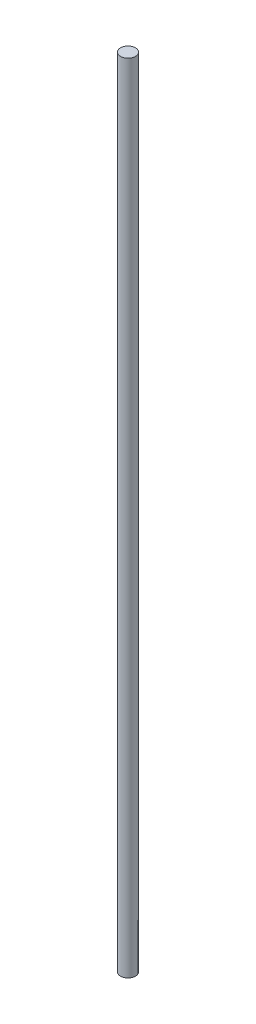
ISO-10303-21;
HEADER;
FILE_DESCRIPTION(('STEP AP214'),'2;1');
FILE_NAME('part.step','',(''),(''),'','','');
FILE_SCHEMA(('AUTOMOTIVE_DESIGN { 1 0 10303 214 1 1 1 1 }'));
ENDSEC;
DATA;
#1=APPLICATION_CONTEXT('core data for automotive mechanical design processes');
#2=APPLICATION_PROTOCOL_DEFINITION('international standard','automotive_design',2000,#1);
#3=PRODUCT_CONTEXT('',#1,'mechanical');
#4=PRODUCT('Part','Part','',(#3));
#5=PRODUCT_RELATED_PRODUCT_CATEGORY('part','',(#4));
#6=PRODUCT_DEFINITION_FORMATION('','',#4);
#7=PRODUCT_DEFINITION_CONTEXT('part definition',#1,'design');
#8=PRODUCT_DEFINITION('design','',#6,#7);
#9=PRODUCT_DEFINITION_SHAPE('','',#8);
#10=(LENGTH_UNIT() NAMED_UNIT(*) SI_UNIT(.MILLI.,.METRE.));
#11=(NAMED_UNIT(*) PLANE_ANGLE_UNIT() SI_UNIT($,.RADIAN.));
#12=(NAMED_UNIT(*) SI_UNIT($,.STERADIAN.) SOLID_ANGLE_UNIT());
#13=UNCERTAINTY_MEASURE_WITH_UNIT(LENGTH_MEASURE(1.E-05),#10,'distance_accuracy_value','');
#14=(GEOMETRIC_REPRESENTATION_CONTEXT(3) GLOBAL_UNCERTAINTY_ASSIGNED_CONTEXT((#13)) GLOBAL_UNIT_ASSIGNED_CONTEXT((#10,
#11,#12)) REPRESENTATION_CONTEXT('',''));
#15=CARTESIAN_POINT('',(0.,0.,0.));
#16=DIRECTION('',(0.,0.,1.));
#17=DIRECTION('',(1.,0.,0.));
#18=AXIS2_PLACEMENT_3D('',#15,#16,#17);
#19=CARTESIAN_POINT('',(0.,480.,0.));
#20=DIRECTION('',(0.,-1.,0.));
#21=DIRECTION('',(0.,0.,-1.));
#22=AXIS2_PLACEMENT_3D('',#19,#20,#21);
#23=CYLINDRICAL_SURFACE('',#22,4.5);
#24=CARTESIAN_POINT('',(0.,480.,0.));
#25=DIRECTION('',(0.,1.,0.));
#26=DIRECTION('',(0.,0.,1.));
#27=AXIS2_PLACEMENT_3D('',#24,#25,#26);
#28=CIRCLE('',#27,4.5);
#29=CARTESIAN_POINT('',(0.,480.,4.5));
#30=VERTEX_POINT('',#29);
#31=EDGE_CURVE('E10',#30,#30,#28,.T.);
#32=ORIENTED_EDGE('',*,*,#31,.F.);
#33=EDGE_LOOP('',(#32));
#34=FACE_BOUND('',#33,.T.);
#35=CARTESIAN_POINT('',(0.,0.,0.));
#36=DIRECTION('',(0.,1.,0.));
#37=DIRECTION('',(0.,0.,1.));
#38=AXIS2_PLACEMENT_3D('',#35,#36,#37);
#39=CIRCLE('',#38,4.5);
#40=CARTESIAN_POINT('',(0.,0.,4.5));
#41=VERTEX_POINT('',#40);
#42=EDGE_CURVE('E34',#41,#41,#39,.T.);
#43=ORIENTED_EDGE('',*,*,#42,.T.);
#44=EDGE_LOOP('',(#43));
#45=FACE_BOUND('',#44,.T.);
#46=ADVANCED_FACE('F31',(#34,#45),#23,.T.);
#47=CARTESIAN_POINT('',(0.,480.,0.));
#48=DIRECTION('',(0.,1.,0.));
#49=DIRECTION('',(0.,0.,1.));
#50=AXIS2_PLACEMENT_3D('',#47,#48,#49);
#51=PLANE('',#50);
#52=ORIENTED_EDGE('',*,*,#31,.T.);
#53=EDGE_LOOP('',(#52));
#54=FACE_BOUND('',#53,.T.);
#55=ADVANCED_FACE('F46',(#54),#51,.T.);
#56=CARTESIAN_POINT('',(0.,0.,0.));
#57=DIRECTION('',(0.,1.,0.));
#58=DIRECTION('',(0.,0.,1.));
#59=AXIS2_PLACEMENT_3D('',#56,#57,#58);
#60=PLANE('',#59);
#61=ORIENTED_EDGE('',*,*,#42,.F.);
#62=EDGE_LOOP('',(#61));
#63=FACE_BOUND('',#62,.T.);
#64=ADVANCED_FACE('F44',(#63),#60,.F.);
#65=CLOSED_SHELL('',(#46,#55,#64));
#66=MANIFOLD_SOLID_BREP('B2',#65);
#67=ADVANCED_BREP_SHAPE_REPRESENTATION('',(#18,#66),#14);
#68=SHAPE_DEFINITION_REPRESENTATION(#9,#67);
ENDSEC;
END-ISO-10303-21;
